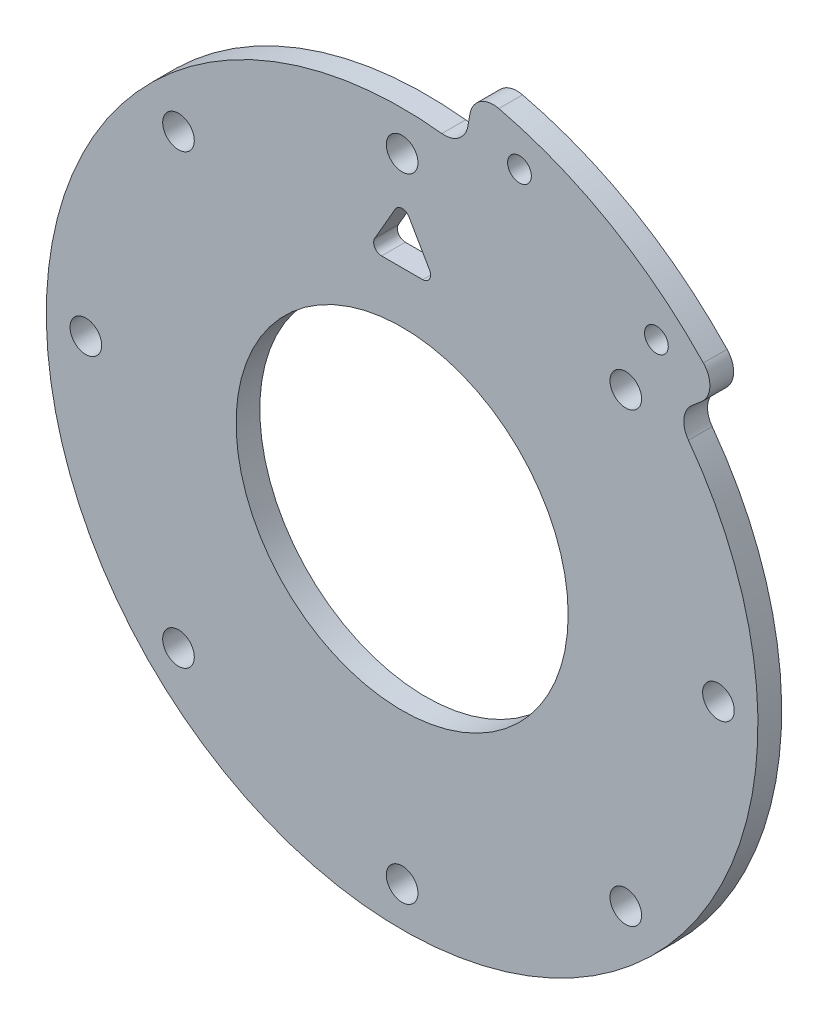
ISO-10303-21;
HEADER;
FILE_DESCRIPTION(('STEP AP214'),'2;1');
FILE_NAME('part.step','',(''),(''),'','','');
FILE_SCHEMA(('AUTOMOTIVE_DESIGN { 1 0 10303 214 1 1 1 1 }'));
ENDSEC;
DATA;
#1=APPLICATION_CONTEXT('core data for automotive mechanical design processes');
#2=APPLICATION_PROTOCOL_DEFINITION('international standard','automotive_design',2000,#1);
#3=PRODUCT_CONTEXT('',#1,'mechanical');
#4=PRODUCT('Part','Part','',(#3));
#5=PRODUCT_RELATED_PRODUCT_CATEGORY('part','',(#4));
#6=PRODUCT_DEFINITION_FORMATION('','',#4);
#7=PRODUCT_DEFINITION_CONTEXT('part definition',#1,'design');
#8=PRODUCT_DEFINITION('design','',#6,#7);
#9=PRODUCT_DEFINITION_SHAPE('','',#8);
#10=(LENGTH_UNIT() NAMED_UNIT(*) SI_UNIT(.MILLI.,.METRE.));
#11=(NAMED_UNIT(*) PLANE_ANGLE_UNIT() SI_UNIT($,.RADIAN.));
#12=(NAMED_UNIT(*) SI_UNIT($,.STERADIAN.) SOLID_ANGLE_UNIT());
#13=UNCERTAINTY_MEASURE_WITH_UNIT(LENGTH_MEASURE(1.E-05),#10,'distance_accuracy_value','');
#14=(GEOMETRIC_REPRESENTATION_CONTEXT(3) GLOBAL_UNCERTAINTY_ASSIGNED_CONTEXT((#13)) GLOBAL_UNIT_ASSIGNED_CONTEXT((#10,
#11,#12)) REPRESENTATION_CONTEXT('',''));
#15=CARTESIAN_POINT('',(0.,0.,0.));
#16=DIRECTION('',(0.,0.,1.));
#17=DIRECTION('',(1.,0.,0.));
#18=AXIS2_PLACEMENT_3D('',#15,#16,#17);
#19=CARTESIAN_POINT('',(0.,0.,3.));
#20=DIRECTION('',(0.,0.,1.));
#21=DIRECTION('',(1.,0.,0.));
#22=AXIS2_PLACEMENT_3D('',#19,#20,#21);
#23=PLANE('',#22);
#24=DIRECTION('',(1.,0.,0.));
#25=VECTOR('',#24,1.);
#26=CARTESIAN_POINT('',(-4.33012701892219,27.5,3.));
#27=LINE('',#26,#25);
#28=CARTESIAN_POINT('',(-2.59807621135331,27.5,3.));
#29=VERTEX_POINT('',#28);
#30=CARTESIAN_POINT('',(2.59807621135331,27.5,3.));
#31=VERTEX_POINT('',#30);
#32=EDGE_CURVE('E168',#29,#31,#27,.T.);
#33=ORIENTED_EDGE('',*,*,#32,.F.);
#34=CARTESIAN_POINT('',(-2.59807621135331,28.5,3.));
#35=DIRECTION('',(0.,0.,1.));
#36=DIRECTION('',(1.,0.,0.));
#37=AXIS2_PLACEMENT_3D('',#34,#35,#36);
#38=CIRCLE('',#37,1.);
#39=CARTESIAN_POINT('',(-3.46410161513775,29.,3.));
#40=VERTEX_POINT('',#39);
#41=EDGE_CURVE('E150',#29,#40,#38,.F.);
#42=ORIENTED_EDGE('',*,*,#41,.T.);
#43=DIRECTION('',(-0.5,-0.866025403784439,0.));
#44=VECTOR('',#43,1.);
#45=CARTESIAN_POINT('',(0.,35.,3.));
#46=LINE('',#45,#44);
#47=CARTESIAN_POINT('',(-0.866025403784439,33.5,3.));
#48=VERTEX_POINT('',#47);
#49=EDGE_CURVE('E186',#48,#40,#46,.T.);
#50=ORIENTED_EDGE('',*,*,#49,.F.);
#51=CARTESIAN_POINT('',(0.,33.,3.));
#52=DIRECTION('',(0.,0.,1.));
#53=DIRECTION('',(1.,0.,0.));
#54=AXIS2_PLACEMENT_3D('',#51,#52,#53);
#55=CIRCLE('',#54,1.);
#56=CARTESIAN_POINT('',(0.866025403784439,33.5,3.));
#57=VERTEX_POINT('',#56);
#58=EDGE_CURVE('E296',#48,#57,#55,.F.);
#59=ORIENTED_EDGE('',*,*,#58,.T.);
#60=DIRECTION('',(-0.5,0.866025403784439,0.));
#61=VECTOR('',#60,1.);
#62=CARTESIAN_POINT('',(4.33012701892219,27.5,3.));
#63=LINE('',#62,#61);
#64=CARTESIAN_POINT('',(3.46410161513775,29.,3.));
#65=VERTEX_POINT('',#64);
#66=EDGE_CURVE('E180',#65,#57,#63,.T.);
#67=ORIENTED_EDGE('',*,*,#66,.F.);
#68=CARTESIAN_POINT('',(2.59807621135331,28.5,3.));
#69=DIRECTION('',(0.,0.,1.));
#70=DIRECTION('',(1.,0.,0.));
#71=AXIS2_PLACEMENT_3D('',#68,#69,#70);
#72=CIRCLE('',#71,1.);
#73=EDGE_CURVE('E178',#65,#31,#72,.F.);
#74=ORIENTED_EDGE('',*,*,#73,.T.);
#75=EDGE_LOOP('',(#33,#42,#50,#59,#67,#74));
#76=FACE_BOUND('',#75,.T.);
#77=CARTESIAN_POINT('',(0.,40.,3.));
#78=DIRECTION('',(0.,0.,1.));
#79=DIRECTION('',(1.,0.,0.));
#80=AXIS2_PLACEMENT_3D('',#77,#78,#79);
#81=CIRCLE('',#80,2.);
#82=CARTESIAN_POINT('',(2.,40.,3.));
#83=VERTEX_POINT('',#82);
#84=EDGE_CURVE('E196',#83,#83,#81,.T.);
#85=ORIENTED_EDGE('',*,*,#84,.F.);
#86=EDGE_LOOP('',(#85));
#87=FACE_BOUND('',#86,.T.);
#88=CARTESIAN_POINT('',(28.2842712474619,28.2842712474619,3.));
#89=DIRECTION('',(0.,0.,1.));
#90=DIRECTION('',(1.,0.,0.));
#91=AXIS2_PLACEMENT_3D('',#88,#89,#90);
#92=CIRCLE('',#91,2.);
#93=CARTESIAN_POINT('',(30.2842712474619,28.2842712474619,3.));
#94=VERTEX_POINT('',#93);
#95=EDGE_CURVE('E201',#94,#94,#92,.T.);
#96=ORIENTED_EDGE('',*,*,#95,.F.);
#97=EDGE_LOOP('',(#96));
#98=FACE_BOUND('',#97,.T.);
#99=CARTESIAN_POINT('',(40.,0.,3.));
#100=DIRECTION('',(0.,0.,1.));
#101=DIRECTION('',(1.,0.,0.));
#102=AXIS2_PLACEMENT_3D('',#99,#100,#101);
#103=CIRCLE('',#102,2.);
#104=CARTESIAN_POINT('',(42.,0.,3.));
#105=VERTEX_POINT('',#104);
#106=EDGE_CURVE('E205',#105,#105,#103,.T.);
#107=ORIENTED_EDGE('',*,*,#106,.F.);
#108=EDGE_LOOP('',(#107));
#109=FACE_BOUND('',#108,.T.);
#110=CARTESIAN_POINT('',(28.2842712474619,-28.2842712474619,3.));
#111=DIRECTION('',(0.,0.,1.));
#112=DIRECTION('',(1.,0.,0.));
#113=AXIS2_PLACEMENT_3D('',#110,#111,#112);
#114=CIRCLE('',#113,2.);
#115=CARTESIAN_POINT('',(30.2842712474619,-28.2842712474619,3.));
#116=VERTEX_POINT('',#115);
#117=EDGE_CURVE('E209',#116,#116,#114,.T.);
#118=ORIENTED_EDGE('',*,*,#117,.F.);
#119=EDGE_LOOP('',(#118));
#120=FACE_BOUND('',#119,.T.);
#121=CARTESIAN_POINT('',(0.,-40.,3.));
#122=DIRECTION('',(0.,0.,1.));
#123=DIRECTION('',(1.,0.,0.));
#124=AXIS2_PLACEMENT_3D('',#121,#122,#123);
#125=CIRCLE('',#124,2.);
#126=CARTESIAN_POINT('',(2.00000000000001,-40.,3.));
#127=VERTEX_POINT('',#126);
#128=EDGE_CURVE('E213',#127,#127,#125,.T.);
#129=ORIENTED_EDGE('',*,*,#128,.F.);
#130=EDGE_LOOP('',(#129));
#131=FACE_BOUND('',#130,.T.);
#132=CARTESIAN_POINT('',(-28.2842712474619,-28.2842712474619,3.));
#133=DIRECTION('',(0.,0.,1.));
#134=DIRECTION('',(1.,0.,0.));
#135=AXIS2_PLACEMENT_3D('',#132,#133,#134);
#136=CIRCLE('',#135,2.);
#137=CARTESIAN_POINT('',(-26.2842712474619,-28.2842712474619,3.));
#138=VERTEX_POINT('',#137);
#139=EDGE_CURVE('E217',#138,#138,#136,.T.);
#140=ORIENTED_EDGE('',*,*,#139,.F.);
#141=EDGE_LOOP('',(#140));
#142=FACE_BOUND('',#141,.T.);
#143=CARTESIAN_POINT('',(-40.,0.,3.));
#144=DIRECTION('',(0.,0.,1.));
#145=DIRECTION('',(1.,0.,0.));
#146=AXIS2_PLACEMENT_3D('',#143,#144,#145);
#147=CIRCLE('',#146,2.);
#148=CARTESIAN_POINT('',(-38.,0.,3.));
#149=VERTEX_POINT('',#148);
#150=EDGE_CURVE('E221',#149,#149,#147,.T.);
#151=ORIENTED_EDGE('',*,*,#150,.F.);
#152=EDGE_LOOP('',(#151));
#153=FACE_BOUND('',#152,.T.);
#154=CARTESIAN_POINT('',(-28.2842712474619,28.2842712474619,3.));
#155=DIRECTION('',(0.,0.,1.));
#156=DIRECTION('',(1.,0.,0.));
#157=AXIS2_PLACEMENT_3D('',#154,#155,#156);
#158=CIRCLE('',#157,2.);
#159=CARTESIAN_POINT('',(-26.2842712474619,28.2842712474619,3.));
#160=VERTEX_POINT('',#159);
#161=EDGE_CURVE('E225',#160,#160,#158,.T.);
#162=ORIENTED_EDGE('',*,*,#161,.F.);
#163=EDGE_LOOP('',(#162));
#164=FACE_BOUND('',#163,.T.);
#165=CARTESIAN_POINT('',(0.,0.,3.));
#166=DIRECTION('',(0.,0.,1.));
#167=DIRECTION('',(1.,0.,0.));
#168=AXIS2_PLACEMENT_3D('',#165,#166,#167);
#169=CIRCLE('',#168,52.4999999999851);
#170=CARTESIAN_POINT('',(38.0981709762389,36.1217298625592,3.));
#171=VERTEX_POINT('',#170);
#172=CARTESIAN_POINT('',(12.2332502014964,51.0548488344254,3.));
#173=VERTEX_POINT('',#172);
#174=EDGE_CURVE('E372',#171,#173,#169,.T.);
#175=ORIENTED_EDGE('',*,*,#174,.T.);
#176=CARTESIAN_POINT('',(11.5342073328393,48.1374289010288,3.));
#177=DIRECTION('',(0.,0.,1.));
#178=DIRECTION('',(1.,0.,0.));
#179=AXIS2_PLACEMENT_3D('',#176,#177,#178);
#180=CIRCLE('',#179,3.);
#181=CARTESIAN_POINT('',(8.57978407380264,48.6583734340296,3.));
#182=VERTEX_POINT('',#181);
#183=EDGE_CURVE('E332',#173,#182,#180,.T.);
#184=ORIENTED_EDGE('',*,*,#183,.T.);
#185=DIRECTION('',(0.173648177666927,0.984807753012209,0.));
#186=VECTOR('',#185,1.);
#187=CARTESIAN_POINT('',(-4.46226016357473E-12,7.86816861778778E-13,3.));
#188=LINE('',#187,#186);
#189=CARTESIAN_POINT('',(8.3188170822595,47.1783560793706,3.));
#190=VERTEX_POINT('',#189);
#191=EDGE_CURVE('E352',#190,#182,#188,.T.);
#192=ORIENTED_EDGE('',*,*,#191,.F.);
#193=CARTESIAN_POINT('',(5.36439382322287,47.6993006123713,3.));
#194=DIRECTION('',(0.,0.,1.));
#195=DIRECTION('',(1.,0.,0.));
#196=AXIS2_PLACEMENT_3D('',#193,#194,#195);
#197=CIRCLE('',#196,3.);
#198=CARTESIAN_POINT('',(5.02911920927144,44.7180943240981,3.));
#199=VERTEX_POINT('',#198);
#200=EDGE_CURVE('E56',#190,#199,#197,.F.);
#201=ORIENTED_EDGE('',*,*,#200,.T.);
#202=CARTESIAN_POINT('',(0.,0.,3.));
#203=DIRECTION('',(0.,0.,1.));
#204=DIRECTION('',(1.,0.,0.));
#205=AXIS2_PLACEMENT_3D('',#202,#203,#204);
#206=CIRCLE('',#205,45.);
#207=CARTESIAN_POINT('',(36.2124460888623,26.714392155938,3.));
#208=VERTEX_POINT('',#207);
#209=EDGE_CURVE('E239',#199,#208,#206,.T.);
#210=ORIENTED_EDGE('',*,*,#209,.T.);
#211=CARTESIAN_POINT('',(38.6266091614532,28.4953516330005,3.));
#212=DIRECTION('',(0.,0.,1.));
#213=DIRECTION('',(1.,0.,0.));
#214=AXIS2_PLACEMENT_3D('',#211,#212,#213);
#215=CIRCLE('',#214,3.);
#216=CARTESIAN_POINT('',(36.6982463323935,30.7934849623574,3.));
#217=VERTEX_POINT('',#216);
#218=EDGE_CURVE('E340',#208,#217,#215,.F.);
#219=ORIENTED_EDGE('',*,*,#218,.T.);
#220=DIRECTION('',(0.766044443118965,0.642787609686555,0.));
#221=VECTOR('',#220,1.);
#222=CARTESIAN_POINT('',(4.06996446155454E-12,-4.85039476878817E-12,3.));
#223=LINE('',#222,#221);
#224=CARTESIAN_POINT('',(37.8494954637986,31.7594976839126,3.));
#225=VERTEX_POINT('',#224);
#226=EDGE_CURVE('E375',#217,#225,#223,.T.);
#227=ORIENTED_EDGE('',*,*,#226,.T.);
#228=CARTESIAN_POINT('',(35.9211326347389,34.0576310132695,3.));
#229=DIRECTION('',(0.,0.,1.));
#230=DIRECTION('',(1.,0.,0.));
#231=AXIS2_PLACEMENT_3D('',#228,#229,#230);
#232=CIRCLE('',#231,3.);
#233=EDGE_CURVE('E329',#225,#171,#232,.T.);
#234=ORIENTED_EDGE('',*,*,#233,.T.);
#235=EDGE_LOOP('',(#175,#184,#192,#201,#210,#219,#227,#234));
#236=FACE_BOUND('',#235,.T.);
#237=CARTESIAN_POINT('',(0.,0.,3.));
#238=DIRECTION('',(0.,0.,1.));
#239=DIRECTION('',(1.,0.,0.));
#240=AXIS2_PLACEMENT_3D('',#237,#238,#239);
#241=CIRCLE('',#240,21.);
#242=CARTESIAN_POINT('',(21.,0.,3.));
#243=VERTEX_POINT('',#242);
#244=EDGE_CURVE('E229',#243,#243,#241,.T.);
#245=ORIENTED_EDGE('',*,*,#244,.F.);
#246=EDGE_LOOP('',(#245));
#247=FACE_BOUND('',#246,.T.);
#248=CARTESIAN_POINT('',(32.1602540378436,35.7031939778693,3.));
#249=DIRECTION('',(0.,0.,1.));
#250=DIRECTION('',(1.,0.,0.));
#251=AXIS2_PLACEMENT_3D('',#248,#249,#250);
#252=CIRCLE('',#251,1.50000000000002);
#253=CARTESIAN_POINT('',(33.6602540378436,35.7031939778693,3.));
#254=VERTEX_POINT('',#253);
#255=EDGE_CURVE('E461',#254,#254,#252,.T.);
#256=ORIENTED_EDGE('',*,*,#255,.F.);
#257=EDGE_LOOP('',(#256));
#258=FACE_BOUND('',#257,.T.);
#259=CARTESIAN_POINT('',(14.8397459621546,45.7031939778689,3.));
#260=DIRECTION('',(0.,0.,1.));
#261=DIRECTION('',(1.,0.,0.));
#262=AXIS2_PLACEMENT_3D('',#259,#260,#261);
#263=CIRCLE('',#262,1.5);
#264=CARTESIAN_POINT('',(16.3397459621546,45.7031939778689,3.));
#265=VERTEX_POINT('',#264);
#266=EDGE_CURVE('E381',#265,#265,#263,.T.);
#267=ORIENTED_EDGE('',*,*,#266,.F.);
#268=EDGE_LOOP('',(#267));
#269=FACE_BOUND('',#268,.T.);
#270=ADVANCED_FACE('F47',(#76,#87,#98,#109,#120,#131,#142,#153,#164,#236,#247,#258,#269),#23,.T.);
#271=CARTESIAN_POINT('',(0.,0.,0.));
#272=DIRECTION('',(0.,0.,1.));
#273=DIRECTION('',(1.,0.,0.));
#274=AXIS2_PLACEMENT_3D('',#271,#272,#273);
#275=PLANE('',#274);
#276=DIRECTION('',(-0.5,0.866025403784439,0.));
#277=VECTOR('',#276,1.);
#278=CARTESIAN_POINT('',(4.33012701892219,27.5,0.));
#279=LINE('',#278,#277);
#280=CARTESIAN_POINT('',(3.46410161513775,29.,0.));
#281=VERTEX_POINT('',#280);
#282=CARTESIAN_POINT('',(0.866025403784439,33.5,0.));
#283=VERTEX_POINT('',#282);
#284=EDGE_CURVE('E386',#281,#283,#279,.T.);
#285=ORIENTED_EDGE('',*,*,#284,.T.);
#286=CARTESIAN_POINT('',(0.,33.,0.));
#287=DIRECTION('',(0.,0.,1.));
#288=DIRECTION('',(1.,0.,0.));
#289=AXIS2_PLACEMENT_3D('',#286,#287,#288);
#290=CIRCLE('',#289,1.);
#291=CARTESIAN_POINT('',(-0.866025403784439,33.5,0.));
#292=VERTEX_POINT('',#291);
#293=EDGE_CURVE('E299',#283,#292,#290,.T.);
#294=ORIENTED_EDGE('',*,*,#293,.T.);
#295=DIRECTION('',(-0.5,-0.866025403784439,0.));
#296=VECTOR('',#295,1.);
#297=CARTESIAN_POINT('',(0.,35.,0.));
#298=LINE('',#297,#296);
#299=CARTESIAN_POINT('',(-3.46410161513775,29.,0.));
#300=VERTEX_POINT('',#299);
#301=EDGE_CURVE('E191',#292,#300,#298,.T.);
#302=ORIENTED_EDGE('',*,*,#301,.T.);
#303=CARTESIAN_POINT('',(-2.59807621135331,28.5,0.));
#304=DIRECTION('',(0.,0.,1.));
#305=DIRECTION('',(1.,0.,0.));
#306=AXIS2_PLACEMENT_3D('',#303,#304,#305);
#307=CIRCLE('',#306,1.);
#308=CARTESIAN_POINT('',(-2.59807621135331,27.5,0.));
#309=VERTEX_POINT('',#308);
#310=EDGE_CURVE('E161',#300,#309,#307,.T.);
#311=ORIENTED_EDGE('',*,*,#310,.T.);
#312=DIRECTION('',(1.,0.,0.));
#313=VECTOR('',#312,1.);
#314=CARTESIAN_POINT('',(-4.33012701892219,27.5,0.));
#315=LINE('',#314,#313);
#316=CARTESIAN_POINT('',(2.59807621135331,27.5,0.));
#317=VERTEX_POINT('',#316);
#318=EDGE_CURVE('E171',#309,#317,#315,.T.);
#319=ORIENTED_EDGE('',*,*,#318,.T.);
#320=CARTESIAN_POINT('',(2.59807621135331,28.5,0.));
#321=DIRECTION('',(0.,0.,1.));
#322=DIRECTION('',(1.,0.,0.));
#323=AXIS2_PLACEMENT_3D('',#320,#321,#322);
#324=CIRCLE('',#323,1.);
#325=EDGE_CURVE('E293',#317,#281,#324,.T.);
#326=ORIENTED_EDGE('',*,*,#325,.T.);
#327=EDGE_LOOP('',(#285,#294,#302,#311,#319,#326));
#328=FACE_BOUND('',#327,.T.);
#329=CARTESIAN_POINT('',(0.,40.,0.));
#330=DIRECTION('',(0.,0.,1.));
#331=DIRECTION('',(1.,0.,0.));
#332=AXIS2_PLACEMENT_3D('',#329,#330,#331);
#333=CIRCLE('',#332,2.);
#334=CARTESIAN_POINT('',(2.,40.,0.));
#335=VERTEX_POINT('',#334);
#336=EDGE_CURVE('E238',#335,#335,#333,.T.);
#337=ORIENTED_EDGE('',*,*,#336,.T.);
#338=EDGE_LOOP('',(#337));
#339=FACE_BOUND('',#338,.T.);
#340=CARTESIAN_POINT('',(28.2842712474619,28.2842712474619,0.));
#341=DIRECTION('',(0.,0.,1.));
#342=DIRECTION('',(1.,0.,0.));
#343=AXIS2_PLACEMENT_3D('',#340,#341,#342);
#344=CIRCLE('',#343,2.);
#345=CARTESIAN_POINT('',(30.2842712474619,28.2842712474619,0.));
#346=VERTEX_POINT('',#345);
#347=EDGE_CURVE('E269',#346,#346,#344,.T.);
#348=ORIENTED_EDGE('',*,*,#347,.T.);
#349=EDGE_LOOP('',(#348));
#350=FACE_BOUND('',#349,.T.);
#351=CARTESIAN_POINT('',(40.,0.,0.));
#352=DIRECTION('',(0.,0.,1.));
#353=DIRECTION('',(1.,0.,0.));
#354=AXIS2_PLACEMENT_3D('',#351,#352,#353);
#355=CIRCLE('',#354,2.);
#356=CARTESIAN_POINT('',(42.,0.,0.));
#357=VERTEX_POINT('',#356);
#358=EDGE_CURVE('E265',#357,#357,#355,.T.);
#359=ORIENTED_EDGE('',*,*,#358,.T.);
#360=EDGE_LOOP('',(#359));
#361=FACE_BOUND('',#360,.T.);
#362=CARTESIAN_POINT('',(28.2842712474619,-28.2842712474619,0.));
#363=DIRECTION('',(0.,0.,1.));
#364=DIRECTION('',(1.,0.,0.));
#365=AXIS2_PLACEMENT_3D('',#362,#363,#364);
#366=CIRCLE('',#365,2.);
#367=CARTESIAN_POINT('',(30.2842712474619,-28.2842712474619,0.));
#368=VERTEX_POINT('',#367);
#369=EDGE_CURVE('E261',#368,#368,#366,.T.);
#370=ORIENTED_EDGE('',*,*,#369,.T.);
#371=EDGE_LOOP('',(#370));
#372=FACE_BOUND('',#371,.T.);
#373=CARTESIAN_POINT('',(0.,-40.,0.));
#374=DIRECTION('',(0.,0.,1.));
#375=DIRECTION('',(1.,0.,0.));
#376=AXIS2_PLACEMENT_3D('',#373,#374,#375);
#377=CIRCLE('',#376,2.);
#378=CARTESIAN_POINT('',(2.00000000000001,-40.,0.));
#379=VERTEX_POINT('',#378);
#380=EDGE_CURVE('E257',#379,#379,#377,.T.);
#381=ORIENTED_EDGE('',*,*,#380,.T.);
#382=EDGE_LOOP('',(#381));
#383=FACE_BOUND('',#382,.T.);
#384=CARTESIAN_POINT('',(-28.2842712474619,-28.2842712474619,0.));
#385=DIRECTION('',(0.,0.,1.));
#386=DIRECTION('',(1.,0.,0.));
#387=AXIS2_PLACEMENT_3D('',#384,#385,#386);
#388=CIRCLE('',#387,2.);
#389=CARTESIAN_POINT('',(-26.2842712474619,-28.2842712474619,0.));
#390=VERTEX_POINT('',#389);
#391=EDGE_CURVE('E253',#390,#390,#388,.T.);
#392=ORIENTED_EDGE('',*,*,#391,.T.);
#393=EDGE_LOOP('',(#392));
#394=FACE_BOUND('',#393,.T.);
#395=CARTESIAN_POINT('',(-40.,0.,0.));
#396=DIRECTION('',(0.,0.,1.));
#397=DIRECTION('',(1.,0.,0.));
#398=AXIS2_PLACEMENT_3D('',#395,#396,#397);
#399=CIRCLE('',#398,2.);
#400=CARTESIAN_POINT('',(-38.,0.,0.));
#401=VERTEX_POINT('',#400);
#402=EDGE_CURVE('E249',#401,#401,#399,.T.);
#403=ORIENTED_EDGE('',*,*,#402,.T.);
#404=EDGE_LOOP('',(#403));
#405=FACE_BOUND('',#404,.T.);
#406=CARTESIAN_POINT('',(-28.2842712474619,28.2842712474619,0.));
#407=DIRECTION('',(0.,0.,1.));
#408=DIRECTION('',(1.,0.,0.));
#409=AXIS2_PLACEMENT_3D('',#406,#407,#408);
#410=CIRCLE('',#409,2.);
#411=CARTESIAN_POINT('',(-26.2842712474619,28.2842712474619,0.));
#412=VERTEX_POINT('',#411);
#413=EDGE_CURVE('E200',#412,#412,#410,.T.);
#414=ORIENTED_EDGE('',*,*,#413,.T.);
#415=EDGE_LOOP('',(#414));
#416=FACE_BOUND('',#415,.T.);
#417=DIRECTION('',(0.173648177666927,0.984807753012209,0.));
#418=VECTOR('',#417,1.);
#419=CARTESIAN_POINT('',(-4.46226016357473E-12,7.86816861778778E-13,0.));
#420=LINE('',#419,#418);
#421=CARTESIAN_POINT('',(8.3188170822595,47.1783560793706,0.));
#422=VERTEX_POINT('',#421);
#423=CARTESIAN_POINT('',(8.57978407380264,48.6583734340296,0.));
#424=VERTEX_POINT('',#423);
#425=EDGE_CURVE('E181',#422,#424,#420,.T.);
#426=ORIENTED_EDGE('',*,*,#425,.T.);
#427=CARTESIAN_POINT('',(11.5342073328393,48.1374289010288,0.));
#428=DIRECTION('',(0.,0.,1.));
#429=DIRECTION('',(1.,0.,0.));
#430=AXIS2_PLACEMENT_3D('',#427,#428,#429);
#431=CIRCLE('',#430,3.);
#432=CARTESIAN_POINT('',(12.2332502014964,51.0548488344254,0.));
#433=VERTEX_POINT('',#432);
#434=EDGE_CURVE('E63',#424,#433,#431,.F.);
#435=ORIENTED_EDGE('',*,*,#434,.T.);
#436=CARTESIAN_POINT('',(0.,0.,0.));
#437=DIRECTION('',(0.,0.,1.));
#438=DIRECTION('',(1.,0.,0.));
#439=AXIS2_PLACEMENT_3D('',#436,#437,#438);
#440=CIRCLE('',#439,52.4999999999851);
#441=CARTESIAN_POINT('',(38.0981709762389,36.1217298625592,0.));
#442=VERTEX_POINT('',#441);
#443=EDGE_CURVE('E188',#442,#433,#440,.T.);
#444=ORIENTED_EDGE('',*,*,#443,.F.);
#445=CARTESIAN_POINT('',(35.9211326347389,34.0576310132695,0.));
#446=DIRECTION('',(0.,0.,1.));
#447=DIRECTION('',(1.,0.,0.));
#448=AXIS2_PLACEMENT_3D('',#445,#446,#447);
#449=CIRCLE('',#448,3.);
#450=CARTESIAN_POINT('',(37.8494954637986,31.7594976839126,0.));
#451=VERTEX_POINT('',#450);
#452=EDGE_CURVE('E335',#442,#451,#449,.F.);
#453=ORIENTED_EDGE('',*,*,#452,.T.);
#454=DIRECTION('',(0.766044443118965,0.642787609686555,0.));
#455=VECTOR('',#454,1.);
#456=CARTESIAN_POINT('',(4.06996446155454E-12,-4.85039476878817E-12,0.));
#457=LINE('',#456,#455);
#458=CARTESIAN_POINT('',(36.6982463323935,30.7934849623574,0.));
#459=VERTEX_POINT('',#458);
#460=EDGE_CURVE('E451',#459,#451,#457,.T.);
#461=ORIENTED_EDGE('',*,*,#460,.F.);
#462=CARTESIAN_POINT('',(38.6266091614532,28.4953516330005,0.));
#463=DIRECTION('',(0.,0.,1.));
#464=DIRECTION('',(1.,0.,0.));
#465=AXIS2_PLACEMENT_3D('',#462,#463,#464);
#466=CIRCLE('',#465,3.);
#467=CARTESIAN_POINT('',(36.2124460888623,26.714392155938,0.));
#468=VERTEX_POINT('',#467);
#469=EDGE_CURVE('E343',#459,#468,#466,.T.);
#470=ORIENTED_EDGE('',*,*,#469,.T.);
#471=CARTESIAN_POINT('',(0.,0.,0.));
#472=DIRECTION('',(0.,0.,1.));
#473=DIRECTION('',(1.,0.,0.));
#474=AXIS2_PLACEMENT_3D('',#471,#472,#473);
#475=CIRCLE('',#474,45.);
#476=CARTESIAN_POINT('',(5.02911920927144,44.7180943240981,0.));
#477=VERTEX_POINT('',#476);
#478=EDGE_CURVE('E233',#477,#468,#475,.T.);
#479=ORIENTED_EDGE('',*,*,#478,.F.);
#480=CARTESIAN_POINT('',(5.36439382322287,47.6993006123713,0.));
#481=DIRECTION('',(0.,0.,1.));
#482=DIRECTION('',(1.,0.,0.));
#483=AXIS2_PLACEMENT_3D('',#480,#481,#482);
#484=CIRCLE('',#483,3.);
#485=EDGE_CURVE('E11',#477,#422,#484,.T.);
#486=ORIENTED_EDGE('',*,*,#485,.T.);
#487=EDGE_LOOP('',(#426,#435,#444,#453,#461,#470,#479,#486));
#488=FACE_BOUND('',#487,.T.);
#489=CARTESIAN_POINT('',(0.,0.,0.));
#490=DIRECTION('',(0.,0.,1.));
#491=DIRECTION('',(1.,0.,0.));
#492=AXIS2_PLACEMENT_3D('',#489,#490,#491);
#493=CIRCLE('',#492,21.);
#494=CARTESIAN_POINT('',(21.,0.,0.));
#495=VERTEX_POINT('',#494);
#496=EDGE_CURVE('E234',#495,#495,#493,.T.);
#497=ORIENTED_EDGE('',*,*,#496,.T.);
#498=EDGE_LOOP('',(#497));
#499=FACE_BOUND('',#498,.T.);
#500=CARTESIAN_POINT('',(32.1602540378436,35.7031939778693,0.));
#501=DIRECTION('',(0.,0.,1.));
#502=DIRECTION('',(1.,0.,0.));
#503=AXIS2_PLACEMENT_3D('',#500,#501,#502);
#504=CIRCLE('',#503,1.50000000000002);
#505=CARTESIAN_POINT('',(33.6602540378436,35.7031939778693,0.));
#506=VERTEX_POINT('',#505);
#507=EDGE_CURVE('E379',#506,#506,#504,.T.);
#508=ORIENTED_EDGE('',*,*,#507,.T.);
#509=EDGE_LOOP('',(#508));
#510=FACE_BOUND('',#509,.T.);
#511=CARTESIAN_POINT('',(14.8397459621546,45.7031939778689,0.));
#512=DIRECTION('',(0.,0.,1.));
#513=DIRECTION('',(1.,0.,0.));
#514=AXIS2_PLACEMENT_3D('',#511,#512,#513);
#515=CIRCLE('',#514,1.5);
#516=CARTESIAN_POINT('',(16.3397459621546,45.7031939778689,0.));
#517=VERTEX_POINT('',#516);
#518=EDGE_CURVE('E448',#517,#517,#515,.T.);
#519=ORIENTED_EDGE('',*,*,#518,.T.);
#520=EDGE_LOOP('',(#519));
#521=FACE_BOUND('',#520,.T.);
#522=ADVANCED_FACE('F363',(#328,#339,#350,#361,#372,#383,#394,#405,#416,#488,#499,#510,#521),
#275,.F.);
#523=CARTESIAN_POINT('',(0.,0.,3.));
#524=DIRECTION('',(0.,0.,-1.));
#525=DIRECTION('',(-1.,0.,0.));
#526=AXIS2_PLACEMENT_3D('',#523,#524,#525);
#527=CYLINDRICAL_SURFACE('',#526,45.);
#528=ORIENTED_EDGE('',*,*,#478,.T.);
#529=DIRECTION('',(0.,0.,-1.));
#530=VECTOR('',#529,1.);
#531=CARTESIAN_POINT('',(36.2124460888623,26.714392155938,3.));
#532=LINE('',#531,#530);
#533=EDGE_CURVE('E305',#468,#208,#532,.F.);
#534=ORIENTED_EDGE('',*,*,#533,.T.);
#535=ORIENTED_EDGE('',*,*,#209,.F.);
#536=DIRECTION('',(0.,0.,-1.));
#537=VECTOR('',#536,1.);
#538=CARTESIAN_POINT('',(5.02911920927144,44.7180943240981,3.));
#539=LINE('',#538,#537);
#540=EDGE_CURVE('E302',#199,#477,#539,.T.);
#541=ORIENTED_EDGE('',*,*,#540,.T.);
#542=EDGE_LOOP('',(#528,#534,#535,#541));
#543=FACE_BOUND('',#542,.T.);
#544=ADVANCED_FACE('F357',(#543),#527,.T.);
#545=CARTESIAN_POINT('',(0.,0.,3.));
#546=DIRECTION('',(0.,0.,-1.));
#547=DIRECTION('',(-1.,0.,0.));
#548=AXIS2_PLACEMENT_3D('',#545,#546,#547);
#549=CYLINDRICAL_SURFACE('',#548,21.);
#550=ORIENTED_EDGE('',*,*,#244,.T.);
#551=EDGE_LOOP('',(#550));
#552=FACE_BOUND('',#551,.T.);
#553=ORIENTED_EDGE('',*,*,#496,.F.);
#554=EDGE_LOOP('',(#553));
#555=FACE_BOUND('',#554,.T.);
#556=ADVANCED_FACE('F424',(#552,#555),#549,.F.);
#557=CARTESIAN_POINT('',(-28.2842712474619,28.2842712474619,-7.));
#558=DIRECTION('',(0.,0.,1.));
#559=DIRECTION('',(1.,0.,0.));
#560=AXIS2_PLACEMENT_3D('',#557,#558,#559);
#561=CYLINDRICAL_SURFACE('',#560,2.);
#562=ORIENTED_EDGE('',*,*,#161,.T.);
#563=EDGE_LOOP('',(#562));
#564=FACE_BOUND('',#563,.T.);
#565=ORIENTED_EDGE('',*,*,#413,.F.);
#566=EDGE_LOOP('',(#565));
#567=FACE_BOUND('',#566,.T.);
#568=ADVANCED_FACE('F432',(#564,#567),#561,.F.);
#569=CARTESIAN_POINT('',(-40.,0.,-7.));
#570=DIRECTION('',(0.,0.,1.));
#571=DIRECTION('',(1.,0.,0.));
#572=AXIS2_PLACEMENT_3D('',#569,#570,#571);
#573=CYLINDRICAL_SURFACE('',#572,2.);
#574=ORIENTED_EDGE('',*,*,#150,.T.);
#575=EDGE_LOOP('',(#574));
#576=FACE_BOUND('',#575,.T.);
#577=ORIENTED_EDGE('',*,*,#402,.F.);
#578=EDGE_LOOP('',(#577));
#579=FACE_BOUND('',#578,.T.);
#580=ADVANCED_FACE('F437',(#576,#579),#573,.F.);
#581=CARTESIAN_POINT('',(-28.2842712474619,-28.2842712474619,-7.));
#582=DIRECTION('',(0.,0.,1.));
#583=DIRECTION('',(1.,0.,0.));
#584=AXIS2_PLACEMENT_3D('',#581,#582,#583);
#585=CYLINDRICAL_SURFACE('',#584,2.);
#586=ORIENTED_EDGE('',*,*,#139,.T.);
#587=EDGE_LOOP('',(#586));
#588=FACE_BOUND('',#587,.T.);
#589=ORIENTED_EDGE('',*,*,#391,.F.);
#590=EDGE_LOOP('',(#589));
#591=FACE_BOUND('',#590,.T.);
#592=ADVANCED_FACE('F509',(#588,#591),#585,.F.);
#593=CARTESIAN_POINT('',(0.,-40.,-7.));
#594=DIRECTION('',(0.,0.,1.));
#595=DIRECTION('',(1.,0.,0.));
#596=AXIS2_PLACEMENT_3D('',#593,#594,#595);
#597=CYLINDRICAL_SURFACE('',#596,2.);
#598=ORIENTED_EDGE('',*,*,#128,.T.);
#599=EDGE_LOOP('',(#598));
#600=FACE_BOUND('',#599,.T.);
#601=ORIENTED_EDGE('',*,*,#380,.F.);
#602=EDGE_LOOP('',(#601));
#603=FACE_BOUND('',#602,.T.);
#604=ADVANCED_FACE('F505',(#600,#603),#597,.F.);
#605=CARTESIAN_POINT('',(28.2842712474619,-28.2842712474619,-7.));
#606=DIRECTION('',(0.,0.,1.));
#607=DIRECTION('',(1.,0.,0.));
#608=AXIS2_PLACEMENT_3D('',#605,#606,#607);
#609=CYLINDRICAL_SURFACE('',#608,2.);
#610=ORIENTED_EDGE('',*,*,#117,.T.);
#611=EDGE_LOOP('',(#610));
#612=FACE_BOUND('',#611,.T.);
#613=ORIENTED_EDGE('',*,*,#369,.F.);
#614=EDGE_LOOP('',(#613));
#615=FACE_BOUND('',#614,.T.);
#616=ADVANCED_FACE('F501',(#612,#615),#609,.F.);
#617=CARTESIAN_POINT('',(40.,0.,-7.));
#618=DIRECTION('',(0.,0.,1.));
#619=DIRECTION('',(1.,0.,0.));
#620=AXIS2_PLACEMENT_3D('',#617,#618,#619);
#621=CYLINDRICAL_SURFACE('',#620,2.);
#622=ORIENTED_EDGE('',*,*,#106,.T.);
#623=EDGE_LOOP('',(#622));
#624=FACE_BOUND('',#623,.T.);
#625=ORIENTED_EDGE('',*,*,#358,.F.);
#626=EDGE_LOOP('',(#625));
#627=FACE_BOUND('',#626,.T.);
#628=ADVANCED_FACE('F497',(#624,#627),#621,.F.);
#629=CARTESIAN_POINT('',(28.2842712474619,28.2842712474619,-7.));
#630=DIRECTION('',(0.,0.,1.));
#631=DIRECTION('',(1.,0.,0.));
#632=AXIS2_PLACEMENT_3D('',#629,#630,#631);
#633=CYLINDRICAL_SURFACE('',#632,2.);
#634=ORIENTED_EDGE('',*,*,#95,.T.);
#635=EDGE_LOOP('',(#634));
#636=FACE_BOUND('',#635,.T.);
#637=ORIENTED_EDGE('',*,*,#347,.F.);
#638=EDGE_LOOP('',(#637));
#639=FACE_BOUND('',#638,.T.);
#640=ADVANCED_FACE('F493',(#636,#639),#633,.F.);
#641=CARTESIAN_POINT('',(0.,40.,-7.));
#642=DIRECTION('',(0.,0.,1.));
#643=DIRECTION('',(1.,0.,0.));
#644=AXIS2_PLACEMENT_3D('',#641,#642,#643);
#645=CYLINDRICAL_SURFACE('',#644,2.);
#646=ORIENTED_EDGE('',*,*,#84,.T.);
#647=EDGE_LOOP('',(#646));
#648=FACE_BOUND('',#647,.T.);
#649=ORIENTED_EDGE('',*,*,#336,.F.);
#650=EDGE_LOOP('',(#649));
#651=FACE_BOUND('',#650,.T.);
#652=ADVANCED_FACE('F491',(#648,#651),#645,.F.);
#653=CARTESIAN_POINT('',(-4.33012701892219,27.5,0.));
#654=DIRECTION('',(0.,-1.,0.));
#655=DIRECTION('',(0.,0.,-1.));
#656=AXIS2_PLACEMENT_3D('',#653,#654,#655);
#657=PLANE('',#656);
#658=ORIENTED_EDGE('',*,*,#318,.F.);
#659=DIRECTION('',(0.,0.,1.));
#660=VECTOR('',#659,1.);
#661=CARTESIAN_POINT('',(-2.59807621135331,27.5,3.));
#662=LINE('',#661,#660);
#663=EDGE_CURVE('E154',#309,#29,#662,.T.);
#664=ORIENTED_EDGE('',*,*,#663,.T.);
#665=ORIENTED_EDGE('',*,*,#32,.T.);
#666=DIRECTION('',(0.,0.,1.));
#667=VECTOR('',#666,1.);
#668=CARTESIAN_POINT('',(2.59807621135331,27.5,0.));
#669=LINE('',#668,#667);
#670=EDGE_CURVE('E174',#31,#317,#669,.F.);
#671=ORIENTED_EDGE('',*,*,#670,.T.);
#672=EDGE_LOOP('',(#658,#664,#665,#671));
#673=FACE_BOUND('',#672,.T.);
#674=ADVANCED_FACE('F167',(#673),#657,.F.);
#675=CARTESIAN_POINT('',(0.,35.,0.));
#676=DIRECTION('',(-0.866025403784439,0.5,0.));
#677=DIRECTION('',(-0.5,-0.866025403784439,0.));
#678=AXIS2_PLACEMENT_3D('',#675,#676,#677);
#679=PLANE('',#678);
#680=ORIENTED_EDGE('',*,*,#49,.T.);
#681=DIRECTION('',(0.,0.,1.));
#682=VECTOR('',#681,1.);
#683=CARTESIAN_POINT('',(-3.46410161513775,29.,0.));
#684=LINE('',#683,#682);
#685=EDGE_CURVE('E155',#40,#300,#684,.F.);
#686=ORIENTED_EDGE('',*,*,#685,.T.);
#687=ORIENTED_EDGE('',*,*,#301,.F.);
#688=DIRECTION('',(0.,0.,1.));
#689=VECTOR('',#688,1.);
#690=CARTESIAN_POINT('',(-0.866025403784439,33.5,3.));
#691=LINE('',#690,#689);
#692=EDGE_CURVE('E173',#292,#48,#691,.T.);
#693=ORIENTED_EDGE('',*,*,#692,.T.);
#694=EDGE_LOOP('',(#680,#686,#687,#693));
#695=FACE_BOUND('',#694,.T.);
#696=ADVANCED_FACE('F398',(#695),#679,.F.);
#697=CARTESIAN_POINT('',(4.33012701892219,27.5,0.));
#698=DIRECTION('',(0.866025403784439,0.5,0.));
#699=DIRECTION('',(-0.5,0.866025403784439,0.));
#700=AXIS2_PLACEMENT_3D('',#697,#698,#699);
#701=PLANE('',#700);
#702=ORIENTED_EDGE('',*,*,#284,.F.);
#703=DIRECTION('',(0.,0.,1.));
#704=VECTOR('',#703,1.);
#705=CARTESIAN_POINT('',(3.46410161513775,29.,3.));
#706=LINE('',#705,#704);
#707=EDGE_CURVE('E162',#281,#65,#706,.T.);
#708=ORIENTED_EDGE('',*,*,#707,.T.);
#709=ORIENTED_EDGE('',*,*,#66,.T.);
#710=DIRECTION('',(0.,0.,1.));
#711=VECTOR('',#710,1.);
#712=CARTESIAN_POINT('',(0.86602540378444,33.5,0.));
#713=LINE('',#712,#711);
#714=EDGE_CURVE('E283',#57,#283,#713,.F.);
#715=ORIENTED_EDGE('',*,*,#714,.T.);
#716=EDGE_LOOP('',(#702,#708,#709,#715));
#717=FACE_BOUND('',#716,.T.);
#718=ADVANCED_FACE('F403',(#717),#701,.F.);
#719=CARTESIAN_POINT('',(4.06996446155454E-12,-4.85039476878817E-12,0.));
#720=DIRECTION('',(0.642787609686555,-0.766044443118965,0.));
#721=DIRECTION('',(0.766044443118965,0.642787609686555,0.));
#722=AXIS2_PLACEMENT_3D('',#719,#720,#721);
#723=PLANE('',#722);
#724=ORIENTED_EDGE('',*,*,#226,.F.);
#725=DIRECTION('',(0.,0.,-1.));
#726=VECTOR('',#725,1.);
#727=CARTESIAN_POINT('',(36.6982463323935,30.7934849623574,0.));
#728=LINE('',#727,#726);
#729=EDGE_CURVE('E313',#217,#459,#728,.T.);
#730=ORIENTED_EDGE('',*,*,#729,.T.);
#731=ORIENTED_EDGE('',*,*,#460,.T.);
#732=DIRECTION('',(0.,0.,1.));
#733=VECTOR('',#732,1.);
#734=CARTESIAN_POINT('',(37.8494954637986,31.7594976839126,0.));
#735=LINE('',#734,#733);
#736=EDGE_CURVE('E309',#451,#225,#735,.T.);
#737=ORIENTED_EDGE('',*,*,#736,.T.);
#738=EDGE_LOOP('',(#724,#730,#731,#737));
#739=FACE_BOUND('',#738,.T.);
#740=ADVANCED_FACE('F480',(#739),#723,.T.);
#741=CARTESIAN_POINT('',(-4.46226016357473E-12,7.86816861778778E-13,0.));
#742=DIRECTION('',(0.984807753012208,-0.173648177666927,0.));
#743=DIRECTION('',(0.173648177666927,0.984807753012209,0.));
#744=AXIS2_PLACEMENT_3D('',#741,#742,#743);
#745=PLANE('',#744);
#746=ORIENTED_EDGE('',*,*,#425,.F.);
#747=DIRECTION('',(0.,0.,1.));
#748=VECTOR('',#747,1.);
#749=CARTESIAN_POINT('',(8.3188170822595,47.1783560793706,3.));
#750=LINE('',#749,#748);
#751=EDGE_CURVE('E319',#422,#190,#750,.T.);
#752=ORIENTED_EDGE('',*,*,#751,.T.);
#753=ORIENTED_EDGE('',*,*,#191,.T.);
#754=DIRECTION('',(0.,0.,-1.));
#755=VECTOR('',#754,1.);
#756=CARTESIAN_POINT('',(8.57978407380264,48.6583734340296,0.));
#757=LINE('',#756,#755);
#758=EDGE_CURVE('E316',#182,#424,#757,.T.);
#759=ORIENTED_EDGE('',*,*,#758,.T.);
#760=EDGE_LOOP('',(#746,#752,#753,#759));
#761=FACE_BOUND('',#760,.T.);
#762=ADVANCED_FACE('F366',(#761),#745,.F.);
#763=CARTESIAN_POINT('',(14.8397459621546,45.7031939778689,0.));
#764=DIRECTION('',(0.,0.,1.));
#765=DIRECTION('',(1.,0.,0.));
#766=AXIS2_PLACEMENT_3D('',#763,#764,#765);
#767=CYLINDRICAL_SURFACE('',#766,1.5);
#768=ORIENTED_EDGE('',*,*,#518,.F.);
#769=EDGE_LOOP('',(#768));
#770=FACE_BOUND('',#769,.T.);
#771=ORIENTED_EDGE('',*,*,#266,.T.);
#772=EDGE_LOOP('',(#771));
#773=FACE_BOUND('',#772,.T.);
#774=ADVANCED_FACE('F468',(#770,#773),#767,.F.);
#775=CARTESIAN_POINT('',(32.1602540378436,35.7031939778693,0.));
#776=DIRECTION('',(0.,0.,1.));
#777=DIRECTION('',(1.,0.,0.));
#778=AXIS2_PLACEMENT_3D('',#775,#776,#777);
#779=CYLINDRICAL_SURFACE('',#778,1.50000000000002);
#780=ORIENTED_EDGE('',*,*,#507,.F.);
#781=EDGE_LOOP('',(#780));
#782=FACE_BOUND('',#781,.T.);
#783=ORIENTED_EDGE('',*,*,#255,.T.);
#784=EDGE_LOOP('',(#783));
#785=FACE_BOUND('',#784,.T.);
#786=ADVANCED_FACE('F471',(#782,#785),#779,.F.);
#787=CARTESIAN_POINT('',(0.,0.,0.));
#788=DIRECTION('',(0.,0.,1.));
#789=DIRECTION('',(1.,0.,0.));
#790=AXIS2_PLACEMENT_3D('',#787,#788,#789);
#791=CYLINDRICAL_SURFACE('',#790,52.4999999999851);
#792=ORIENTED_EDGE('',*,*,#443,.T.);
#793=DIRECTION('',(0.,0.,1.));
#794=VECTOR('',#793,1.);
#795=CARTESIAN_POINT('',(12.2332502014964,51.0548488344253,0.));
#796=LINE('',#795,#794);
#797=EDGE_CURVE('E325',#433,#173,#796,.T.);
#798=ORIENTED_EDGE('',*,*,#797,.T.);
#799=ORIENTED_EDGE('',*,*,#174,.F.);
#800=DIRECTION('',(0.,0.,1.));
#801=VECTOR('',#800,1.);
#802=CARTESIAN_POINT('',(38.0981709762389,36.1217298625592,0.));
#803=LINE('',#802,#801);
#804=EDGE_CURVE('E70',#171,#442,#803,.F.);
#805=ORIENTED_EDGE('',*,*,#804,.T.);
#806=EDGE_LOOP('',(#792,#798,#799,#805));
#807=FACE_BOUND('',#806,.T.);
#808=ADVANCED_FACE('F371',(#807),#791,.T.);
#809=CARTESIAN_POINT('',(-2.59807621135331,28.5,0.));
#810=DIRECTION('',(0.,0.,-1.));
#811=DIRECTION('',(-1.,0.,0.));
#812=AXIS2_PLACEMENT_3D('',#809,#810,#811);
#813=CYLINDRICAL_SURFACE('',#812,1.);
#814=ORIENTED_EDGE('',*,*,#310,.F.);
#815=ORIENTED_EDGE('',*,*,#685,.F.);
#816=ORIENTED_EDGE('',*,*,#41,.F.);
#817=ORIENTED_EDGE('',*,*,#663,.F.);
#818=EDGE_LOOP('',(#814,#815,#816,#817));
#819=FACE_BOUND('',#818,.T.);
#820=ADVANCED_FACE('F153',(#819),#813,.F.);
#821=CARTESIAN_POINT('',(2.59807621135331,28.5,0.));
#822=DIRECTION('',(0.,0.,-1.));
#823=DIRECTION('',(-1.,0.,0.));
#824=AXIS2_PLACEMENT_3D('',#821,#822,#823);
#825=CYLINDRICAL_SURFACE('',#824,1.);
#826=ORIENTED_EDGE('',*,*,#325,.F.);
#827=ORIENTED_EDGE('',*,*,#670,.F.);
#828=ORIENTED_EDGE('',*,*,#73,.F.);
#829=ORIENTED_EDGE('',*,*,#707,.F.);
#830=EDGE_LOOP('',(#826,#827,#828,#829));
#831=FACE_BOUND('',#830,.T.);
#832=ADVANCED_FACE('F407',(#831),#825,.F.);
#833=CARTESIAN_POINT('',(0.,33.,0.));
#834=DIRECTION('',(0.,0.,-1.));
#835=DIRECTION('',(-1.,0.,0.));
#836=AXIS2_PLACEMENT_3D('',#833,#834,#835);
#837=CYLINDRICAL_SURFACE('',#836,1.);
#838=ORIENTED_EDGE('',*,*,#293,.F.);
#839=ORIENTED_EDGE('',*,*,#714,.F.);
#840=ORIENTED_EDGE('',*,*,#58,.F.);
#841=ORIENTED_EDGE('',*,*,#692,.F.);
#842=EDGE_LOOP('',(#838,#839,#840,#841));
#843=FACE_BOUND('',#842,.T.);
#844=ADVANCED_FACE('F400',(#843),#837,.F.);
#845=CARTESIAN_POINT('',(38.6266091614532,28.4953516330005,3.));
#846=DIRECTION('',(0.,0.,-1.));
#847=DIRECTION('',(-1.,0.,0.));
#848=AXIS2_PLACEMENT_3D('',#845,#846,#847);
#849=CYLINDRICAL_SURFACE('',#848,3.);
#850=ORIENTED_EDGE('',*,*,#469,.F.);
#851=ORIENTED_EDGE('',*,*,#729,.F.);
#852=ORIENTED_EDGE('',*,*,#218,.F.);
#853=ORIENTED_EDGE('',*,*,#533,.F.);
#854=EDGE_LOOP('',(#850,#851,#852,#853));
#855=FACE_BOUND('',#854,.T.);
#856=ADVANCED_FACE('F414',(#855),#849,.F.);
#857=CARTESIAN_POINT('',(5.36439382322287,47.6993006123713,3.));
#858=DIRECTION('',(0.,0.,-1.));
#859=DIRECTION('',(-1.,0.,0.));
#860=AXIS2_PLACEMENT_3D('',#857,#858,#859);
#861=CYLINDRICAL_SURFACE('',#860,3.);
#862=ORIENTED_EDGE('',*,*,#485,.F.);
#863=ORIENTED_EDGE('',*,*,#540,.F.);
#864=ORIENTED_EDGE('',*,*,#200,.F.);
#865=ORIENTED_EDGE('',*,*,#751,.F.);
#866=EDGE_LOOP('',(#862,#863,#864,#865));
#867=FACE_BOUND('',#866,.T.);
#868=ADVANCED_FACE('F361',(#867),#861,.F.);
#869=CARTESIAN_POINT('',(11.5342073328393,48.1374289010288,0.));
#870=DIRECTION('',(0.,0.,1.));
#871=DIRECTION('',(1.,0.,0.));
#872=AXIS2_PLACEMENT_3D('',#869,#870,#871);
#873=CYLINDRICAL_SURFACE('',#872,3.);
#874=ORIENTED_EDGE('',*,*,#434,.F.);
#875=ORIENTED_EDGE('',*,*,#758,.F.);
#876=ORIENTED_EDGE('',*,*,#183,.F.);
#877=ORIENTED_EDGE('',*,*,#797,.F.);
#878=EDGE_LOOP('',(#874,#875,#876,#877));
#879=FACE_BOUND('',#878,.T.);
#880=ADVANCED_FACE('F369',(#879),#873,.T.);
#881=CARTESIAN_POINT('',(35.9211326347389,34.0576310132695,0.));
#882=DIRECTION('',(0.,0.,1.));
#883=DIRECTION('',(1.,0.,0.));
#884=AXIS2_PLACEMENT_3D('',#881,#882,#883);
#885=CYLINDRICAL_SURFACE('',#884,3.);
#886=ORIENTED_EDGE('',*,*,#452,.F.);
#887=ORIENTED_EDGE('',*,*,#804,.F.);
#888=ORIENTED_EDGE('',*,*,#233,.F.);
#889=ORIENTED_EDGE('',*,*,#736,.F.);
#890=EDGE_LOOP('',(#886,#887,#888,#889));
#891=FACE_BOUND('',#890,.T.);
#892=ADVANCED_FACE('F49',(#891),#885,.T.);
#893=CLOSED_SHELL('',(#270,#522,#544,#556,#568,#580,#592,#604,#616,#628,#640,#652,#674,#696,
#718,#740,#762,#774,#786,#808,#820,#832,#844,#856,#868,#880,#892));
#894=MANIFOLD_SOLID_BREP('B2',#893);
#895=ADVANCED_BREP_SHAPE_REPRESENTATION('',(#18,#894),#14);
#896=SHAPE_DEFINITION_REPRESENTATION(#9,#895);
ENDSEC;
END-ISO-10303-21;
